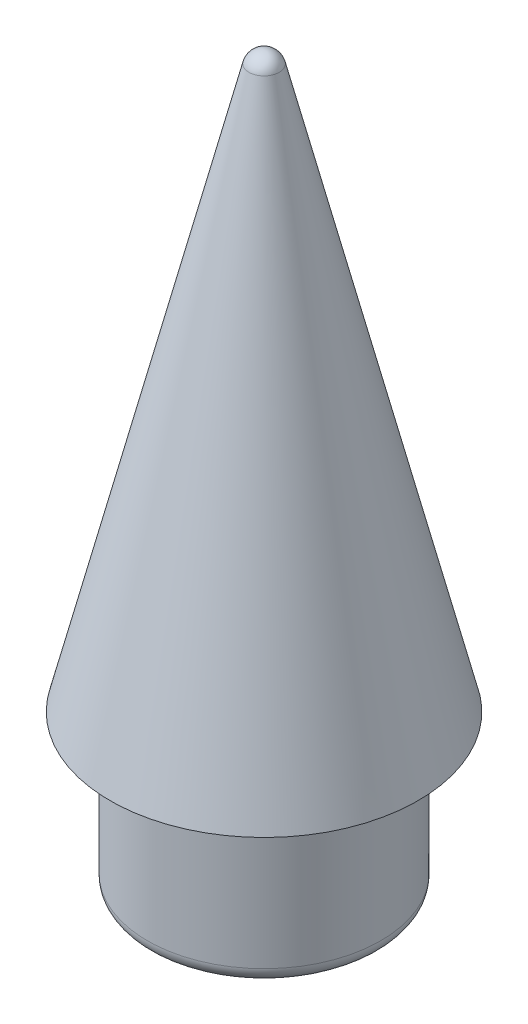
ISO-10303-21;
HEADER;
FILE_DESCRIPTION(('STEP AP214'),'2;1');
FILE_NAME('part.step','',(''),(''),'','','');
FILE_SCHEMA(('AUTOMOTIVE_DESIGN { 1 0 10303 214 1 1 1 1 }'));
ENDSEC;
DATA;
#1=APPLICATION_CONTEXT('core data for automotive mechanical design processes');
#2=APPLICATION_PROTOCOL_DEFINITION('international standard','automotive_design',2000,#1);
#3=PRODUCT_CONTEXT('',#1,'mechanical');
#4=PRODUCT('Part','Part','',(#3));
#5=PRODUCT_RELATED_PRODUCT_CATEGORY('part','',(#4));
#6=PRODUCT_DEFINITION_FORMATION('','',#4);
#7=PRODUCT_DEFINITION_CONTEXT('part definition',#1,'design');
#8=PRODUCT_DEFINITION('design','',#6,#7);
#9=PRODUCT_DEFINITION_SHAPE('','',#8);
#10=(LENGTH_UNIT() NAMED_UNIT(*) SI_UNIT(.MILLI.,.METRE.));
#11=(NAMED_UNIT(*) PLANE_ANGLE_UNIT() SI_UNIT($,.RADIAN.));
#12=(NAMED_UNIT(*) SI_UNIT($,.STERADIAN.) SOLID_ANGLE_UNIT());
#13=UNCERTAINTY_MEASURE_WITH_UNIT(LENGTH_MEASURE(1.E-05),#10,'distance_accuracy_value','');
#14=(GEOMETRIC_REPRESENTATION_CONTEXT(3) GLOBAL_UNCERTAINTY_ASSIGNED_CONTEXT((#13)) GLOBAL_UNIT_ASSIGNED_CONTEXT((#10,
#11,#12)) REPRESENTATION_CONTEXT('',''));
#15=CARTESIAN_POINT('',(0.,0.,0.));
#16=DIRECTION('',(0.,0.,1.));
#17=DIRECTION('',(1.,0.,0.));
#18=AXIS2_PLACEMENT_3D('',#15,#16,#17);
#19=CARTESIAN_POINT('',(0.,14.2751186778182,0.));
#20=DIRECTION('',(0.,-1.,0.));
#21=DIRECTION('',(0.,0.,-1.));
#22=AXIS2_PLACEMENT_3D('',#19,#20,#21);
#23=CONICAL_SURFACE('',#22,12.18315812724,0.242624341402582);
#24=CARTESIAN_POINT('',(0.,58.5189788336988,0.));
#25=DIRECTION('',(0.,-1.,0.));
#26=DIRECTION('',(0.,0.,-1.));
#27=AXIS2_PLACEMENT_3D('',#24,#25,#26);
#28=CIRCLE('',#27,1.23280273865953);
#29=CARTESIAN_POINT('',(0.,58.5189788336988,-1.23280273865953));
#30=VERTEX_POINT('',#29);
#31=EDGE_CURVE('E68',#30,#30,#28,.T.);
#32=CARTESIAN_POINT('',(0.,12.7,0.));
#33=DIRECTION('',(0.,-1.,0.));
#34=DIRECTION('',(0.,0.,-1.));
#35=AXIS2_PLACEMENT_3D('',#32,#33,#34);
#36=CIRCLE('',#35,12.573);
#37=CARTESIAN_POINT('',(0.,12.7,-12.573));
#38=VERTEX_POINT('',#37);
#39=EDGE_CURVE('E10',#38,#38,#36,.F.);
#40=CARTESIAN_POINT('',(0.,58.5189788336988,-1.23280273865953));
#41=CARTESIAN_POINT('',(0.,58.0416978041811,-1.35092979346516));
#42=CARTESIAN_POINT('',(0.,57.5644167746634,-1.46905684827079));
#43=CARTESIAN_POINT('',(0.,56.6098547156281,-1.70531095788205));
#44=CARTESIAN_POINT('',(0.,56.1325736861104,-1.82343801268768));
#45=CARTESIAN_POINT('',(0.,55.178011627075,-2.05969212229894));
#46=CARTESIAN_POINT('',(0.,54.7007305975573,-2.17781917710457));
#47=CARTESIAN_POINT('',(0.,53.7461685385219,-2.41407328671583));
#48=CARTESIAN_POINT('',(0.,53.2688875090042,-2.53220034152146));
#49=CARTESIAN_POINT('',(0.,52.3143254499688,-2.76845445113272));
#50=CARTESIAN_POINT('',(0.,51.8370444204511,-2.88658150593835));
#51=CARTESIAN_POINT('',(0.,50.8824823614157,-3.12283561554961));
#52=CARTESIAN_POINT('',(0.,50.405201331898,-3.24096267035524));
#53=CARTESIAN_POINT('',(0.,49.4506392728626,-3.4772167799665));
#54=CARTESIAN_POINT('',(0.,48.9733582433449,-3.59534383477213));
#55=CARTESIAN_POINT('',(0.,48.0187961843095,-3.83159794438339));
#56=CARTESIAN_POINT('',(0.,47.5415151547918,-3.94972499918902));
#57=CARTESIAN_POINT('',(0.,46.5869530957564,-4.18597910880028));
#58=CARTESIAN_POINT('',(0.,46.1096720662387,-4.30410616360591));
#59=CARTESIAN_POINT('',(0.,45.1551100072033,-4.54036027321717));
#60=CARTESIAN_POINT('',(0.,44.6778289776856,-4.6584873280228));
#61=CARTESIAN_POINT('',(0.,43.7232669186503,-4.89474143763406));
#62=CARTESIAN_POINT('',(0.,43.2459858891326,-5.01286849243969));
#63=CARTESIAN_POINT('',(0.,42.2914238300972,-5.24912260205095));
#64=CARTESIAN_POINT('',(0.,41.8141428005795,-5.36724965685658));
#65=CARTESIAN_POINT('',(0.,40.8595807415441,-5.60350376646784));
#66=CARTESIAN_POINT('',(0.,40.3822997120264,-5.72163082127347));
#67=CARTESIAN_POINT('',(0.,39.427737652991,-5.95788493088473));
#68=CARTESIAN_POINT('',(0.,38.9504566234733,-6.07601198569036));
#69=CARTESIAN_POINT('',(0.,37.9958945644379,-6.31226609530162));
#70=CARTESIAN_POINT('',(0.,37.5186135349202,-6.43039315010725));
#71=CARTESIAN_POINT('',(0.,36.5640514758848,-6.66664725971851));
#72=CARTESIAN_POINT('',(0.,36.0867704463671,-6.78477431452414));
#73=CARTESIAN_POINT('',(0.,35.1322083873317,-7.0210284241354));
#74=CARTESIAN_POINT('',(0.,34.654927357814,-7.13915547894103));
#75=CARTESIAN_POINT('',(0.,33.7003652987786,-7.37540958855229));
#76=CARTESIAN_POINT('',(0.,33.2230842692609,-7.49353664335792));
#77=CARTESIAN_POINT('',(0.,32.2685222102255,-7.72979075296918));
#78=CARTESIAN_POINT('',(0.,31.7912411807079,-7.84791780777481));
#79=CARTESIAN_POINT('',(0.,30.8366791216725,-8.08417191738607));
#80=CARTESIAN_POINT('',(0.,30.3593980921548,-8.2022989721917));
#81=CARTESIAN_POINT('',(0.,29.4048360331194,-8.43855308180296));
#82=CARTESIAN_POINT('',(0.,28.9275550036017,-8.55668013660859));
#83=CARTESIAN_POINT('',(0.,27.9729929445663,-8.79293424621985));
#84=CARTESIAN_POINT('',(0.,27.4957119150486,-8.91106130102547));
#85=CARTESIAN_POINT('',(0.,26.5411498560132,-9.14731541063673));
#86=CARTESIAN_POINT('',(0.,26.0638688264955,-9.26544246544237));
#87=CARTESIAN_POINT('',(0.,25.1093067674601,-9.50169657505363));
#88=CARTESIAN_POINT('',(0.,24.6320257379424,-9.61982362985925));
#89=CARTESIAN_POINT('',(0.,23.677463678907,-9.85607773947051));
#90=CARTESIAN_POINT('',(0.,23.2001826493893,-9.97420479427615));
#91=CARTESIAN_POINT('',(0.,22.2456205903539,-10.2104589038874));
#92=CARTESIAN_POINT('',(0.,21.7683395608362,-10.328585958693));
#93=CARTESIAN_POINT('',(0.,20.8137775018008,-10.5648400683043));
#94=CARTESIAN_POINT('',(0.,20.3364964722831,-10.6829671231099));
#95=CARTESIAN_POINT('',(0.,19.3819344132477,-10.9192212327212));
#96=CARTESIAN_POINT('',(0.,18.9046533837301,-11.0373482875268));
#97=CARTESIAN_POINT('',(0.,17.9500913246947,-11.2736023971381));
#98=CARTESIAN_POINT('',(0.,17.472810295177,-11.3917294519437));
#99=CARTESIAN_POINT('',(0.,16.5182482361416,-11.627983561555));
#100=CARTESIAN_POINT('',(0.,16.0409672066239,-11.7461106163606));
#101=CARTESIAN_POINT('',(0.,15.0864051475885,-11.9823647259719));
#102=CARTESIAN_POINT('',(0.,14.6091241180708,-12.1004917807775));
#103=CARTESIAN_POINT('',(0.,13.6545620590354,-12.3367458903887));
#104=CARTESIAN_POINT('',(0.,13.1772810295177,-12.4548729451944));
#105=CARTESIAN_POINT('',(0.,12.7,-12.573));
#106=B_SPLINE_CURVE_WITH_KNOTS('',3,(#40,#41,#42,#43,#44,#45,#46,#47,#48,#49,#50,#51,#52,#53,
#54,#55,#56,#57,#58,#59,#60,#61,#62,#63,#64,#65,#66,#67,#68,#69,#70,#71,#72,#73,#74,#75,#76,#77,
#78,#79,#80,#81,#82,#83,#84,#85,#86,#87,#88,#89,#90,#91,#92,#93,#94,#95,#96,#97,#98,#99,#100,
#101,#102,#103,#104,#105),.UNSPECIFIED.,.F.,.F.,(4,2,2,2,2,2,2,2,2,2,2,2,2,2,2,2,2,2,2,2,2,2,2,
2,2,2,2,2,2,2,2,2,4),(0.,1.47504597892091,2.95009195784181,4.4251379367627,5.90018391568361,
7.37522989460451,8.8502758735254,10.3253218524463,11.8003678313672,13.2754138102881,
14.750459789209,16.2255057681299,17.7005517470508,19.1755977259717,20.6506437048926,
22.1256896838135,23.6007356627344,25.0757816416553,26.5508276205762,28.0258735994971,
29.500919578418,30.9759655573389,32.4510115362598,33.9260575151807,35.4011034941016,
36.8761494730225,38.3511954519434,39.8262414308643,41.3012874097852,42.7763333887061,
44.251379367627,45.7264253465479,47.2014713254689),.UNSPECIFIED.);
#107=EDGE_CURVE('BSEAM43',#30,#38,#106,.T.);
#108=ORIENTED_EDGE('',*,*,#31,.T.);
#109=ORIENTED_EDGE('',*,*,#39,.T.);
#110=ORIENTED_EDGE('',*,*,#107,.T.);
#111=ORIENTED_EDGE('',*,*,#107,.F.);
#112=EDGE_LOOP('',(#108,#110,#109,#111));
#113=FACE_BOUND('',#112,.T.);
#114=ADVANCED_FACE('F43',(#113),#23,.T.);
#115=CARTESIAN_POINT('',(0.,58.2138601558806,0.));
#116=DIRECTION('',(0.,-1.,0.));
#117=DIRECTION('',(1.,0.,0.));
#118=AXIS2_PLACEMENT_3D('',#115,#116,#117);
#119=SPHERICAL_SURFACE('',#118,1.27);
#120=ORIENTED_EDGE('',*,*,#31,.F.);
#121=EDGE_LOOP('',(#120));
#122=FACE_BOUND('',#121,.T.);
#123=ADVANCED_FACE('F72',(#122),#119,.T.);
#124=CARTESIAN_POINT('',(0.,0.,0.));
#125=DIRECTION('',(0.,-1.,0.));
#126=DIRECTION('',(0.,0.,-1.));
#127=AXIS2_PLACEMENT_3D('',#124,#125,#126);
#128=PLANE('',#127);
#129=CARTESIAN_POINT('',(0.,0.,0.));
#130=DIRECTION('',(0.,-1.,0.));
#131=DIRECTION('',(0.,0.,-1.));
#132=AXIS2_PLACEMENT_3D('',#129,#130,#131);
#133=CIRCLE('',#132,8.255);
#134=CARTESIAN_POINT('',(0.,0.,-8.255));
#135=VERTEX_POINT('',#134);
#136=EDGE_CURVE('E49',#135,#135,#133,.T.);
#137=ORIENTED_EDGE('',*,*,#136,.T.);
#138=EDGE_LOOP('',(#137));
#139=FACE_BOUND('',#138,.T.);
#140=ADVANCED_FACE('F71',(#139),#128,.T.);
#141=CARTESIAN_POINT('',(0.,1.27,0.));
#142=DIRECTION('',(0.,-1.,0.));
#143=DIRECTION('',(0.,0.,-1.));
#144=AXIS2_PLACEMENT_3D('',#141,#142,#143);
#145=TOROIDAL_SURFACE('',#144,8.255,1.27);
#146=CARTESIAN_POINT('',(0.,1.27,0.));
#147=DIRECTION('',(0.,-1.,0.));
#148=DIRECTION('',(0.,0.,-1.));
#149=AXIS2_PLACEMENT_3D('',#146,#147,#148);
#150=CIRCLE('',#149,9.525);
#151=CARTESIAN_POINT('',(0.,1.27,-9.525));
#152=VERTEX_POINT('',#151);
#153=EDGE_CURVE('E53',#152,#152,#150,.T.);
#154=ORIENTED_EDGE('',*,*,#153,.T.);
#155=EDGE_LOOP('',(#154));
#156=FACE_BOUND('',#155,.T.);
#157=ORIENTED_EDGE('',*,*,#136,.F.);
#158=EDGE_LOOP('',(#157));
#159=FACE_BOUND('',#158,.T.);
#160=ADVANCED_FACE('F78',(#156,#159),#145,.T.);
#161=CARTESIAN_POINT('',(0.,0.,0.));
#162=DIRECTION('',(0.,-1.,0.));
#163=DIRECTION('',(0.,0.,-1.));
#164=AXIS2_PLACEMENT_3D('',#161,#162,#163);
#165=CYLINDRICAL_SURFACE('',#164,9.525);
#166=CARTESIAN_POINT('',(0.,11.43,0.));
#167=DIRECTION('',(0.,-1.,0.));
#168=DIRECTION('',(0.,0.,-1.));
#169=AXIS2_PLACEMENT_3D('',#166,#167,#168);
#170=CIRCLE('',#169,9.525);
#171=CARTESIAN_POINT('',(0.,11.43,-9.525));
#172=VERTEX_POINT('',#171);
#173=EDGE_CURVE('E59',#172,#172,#170,.T.);
#174=ORIENTED_EDGE('',*,*,#173,.T.);
#175=EDGE_LOOP('',(#174));
#176=FACE_BOUND('',#175,.T.);
#177=ORIENTED_EDGE('',*,*,#153,.F.);
#178=EDGE_LOOP('',(#177));
#179=FACE_BOUND('',#178,.T.);
#180=ADVANCED_FACE('F81',(#176,#179),#165,.T.);
#181=CARTESIAN_POINT('',(0.,11.43,0.));
#182=DIRECTION('',(0.,-1.,0.));
#183=DIRECTION('',(0.,0.,-1.));
#184=AXIS2_PLACEMENT_3D('',#181,#182,#183);
#185=TOROIDAL_SURFACE('',#184,10.795,1.27);
#186=CARTESIAN_POINT('',(0.,12.7,0.));
#187=DIRECTION('',(0.,-1.,0.));
#188=DIRECTION('',(0.,0.,-1.));
#189=AXIS2_PLACEMENT_3D('',#186,#187,#188);
#190=CIRCLE('',#189,10.795);
#191=CARTESIAN_POINT('',(0.,12.7,-10.795));
#192=VERTEX_POINT('',#191);
#193=EDGE_CURVE('E64',#192,#192,#190,.T.);
#194=ORIENTED_EDGE('',*,*,#193,.T.);
#195=EDGE_LOOP('',(#194));
#196=FACE_BOUND('',#195,.T.);
#197=ORIENTED_EDGE('',*,*,#173,.F.);
#198=EDGE_LOOP('',(#197));
#199=FACE_BOUND('',#198,.T.);
#200=ADVANCED_FACE('F82',(#196,#199),#185,.F.);
#201=CARTESIAN_POINT('',(10.795,12.7,0.));
#202=DIRECTION('',(0.,-1.,0.));
#203=DIRECTION('',(0.,0.,-1.));
#204=AXIS2_PLACEMENT_3D('',#201,#202,#203);
#205=PLANE('',#204);
#206=ORIENTED_EDGE('',*,*,#39,.F.);
#207=EDGE_LOOP('',(#206));
#208=FACE_BOUND('',#207,.T.);
#209=ORIENTED_EDGE('',*,*,#193,.F.);
#210=EDGE_LOOP('',(#209));
#211=FACE_BOUND('',#210,.T.);
#212=ADVANCED_FACE('F44',(#208,#211),#205,.T.);
#213=CLOSED_SHELL('',(#114,#123,#140,#160,#180,#200,#212));
#214=MANIFOLD_SOLID_BREP('B2',#213);
#215=ADVANCED_BREP_SHAPE_REPRESENTATION('',(#18,#214),#14);
#216=SHAPE_DEFINITION_REPRESENTATION(#9,#215);
ENDSEC;
END-ISO-10303-21;
